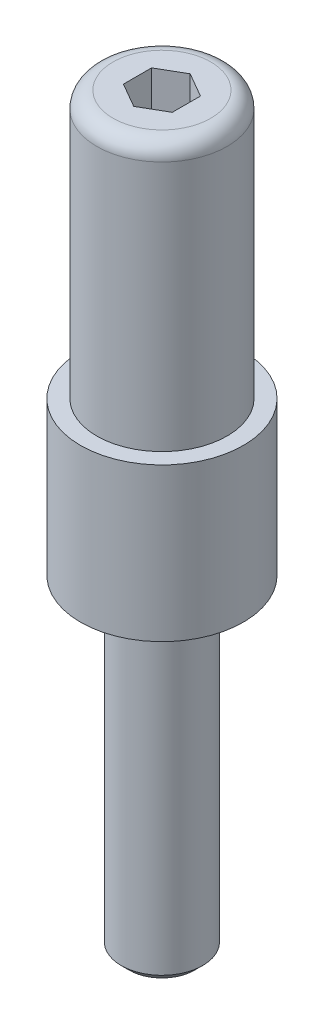
ISO-10303-21;
HEADER;
FILE_DESCRIPTION(('STEP AP214'),'2;1');
FILE_NAME('part.step','',(''),(''),'','','');
FILE_SCHEMA(('AUTOMOTIVE_DESIGN { 1 0 10303 214 1 1 1 1 }'));
ENDSEC;
DATA;
#1=APPLICATION_CONTEXT('core data for automotive mechanical design processes');
#2=APPLICATION_PROTOCOL_DEFINITION('international standard','automotive_design',2000,#1);
#3=PRODUCT_CONTEXT('',#1,'mechanical');
#4=PRODUCT('Part','Part','',(#3));
#5=PRODUCT_RELATED_PRODUCT_CATEGORY('part','',(#4));
#6=PRODUCT_DEFINITION_FORMATION('','',#4);
#7=PRODUCT_DEFINITION_CONTEXT('part definition',#1,'design');
#8=PRODUCT_DEFINITION('design','',#6,#7);
#9=PRODUCT_DEFINITION_SHAPE('','',#8);
#10=(LENGTH_UNIT() NAMED_UNIT(*) SI_UNIT(.MILLI.,.METRE.));
#11=(NAMED_UNIT(*) PLANE_ANGLE_UNIT() SI_UNIT($,.RADIAN.));
#12=(NAMED_UNIT(*) SI_UNIT($,.STERADIAN.) SOLID_ANGLE_UNIT());
#13=UNCERTAINTY_MEASURE_WITH_UNIT(LENGTH_MEASURE(1.E-05),#10,'distance_accuracy_value','');
#14=(GEOMETRIC_REPRESENTATION_CONTEXT(3) GLOBAL_UNCERTAINTY_ASSIGNED_CONTEXT((#13)) GLOBAL_UNIT_ASSIGNED_CONTEXT((#10,
#11,#12)) REPRESENTATION_CONTEXT('',''));
#15=CARTESIAN_POINT('',(0.,0.,0.));
#16=DIRECTION('',(0.,0.,1.));
#17=DIRECTION('',(1.,0.,0.));
#18=AXIS2_PLACEMENT_3D('',#15,#16,#17);
#19=CARTESIAN_POINT('',(0.,25.8,0.));
#20=DIRECTION('',(0.,-1.,0.));
#21=DIRECTION('',(0.,0.,-1.));
#22=AXIS2_PLACEMENT_3D('',#19,#20,#21);
#23=PLANE('',#22);
#24=DIRECTION('',(0.,0.,-1.));
#25=VECTOR('',#24,1.);
#26=CARTESIAN_POINT('',(-1.5,25.8,0.));
#27=LINE('',#26,#25);
#28=CARTESIAN_POINT('',(-1.5,25.8,0.866025403784439));
#29=VERTEX_POINT('',#28);
#30=CARTESIAN_POINT('',(-1.5,25.8,-0.866025403784439));
#31=VERTEX_POINT('',#30);
#32=EDGE_CURVE('E152',#29,#31,#27,.T.);
#33=ORIENTED_EDGE('',*,*,#32,.T.);
#34=DIRECTION('',(0.866025403784439,0.,-0.5));
#35=VECTOR('',#34,1.);
#36=CARTESIAN_POINT('',(-0.75,25.8,-1.29903810567666));
#37=LINE('',#36,#35);
#38=CARTESIAN_POINT('',(0.,25.8,-1.73205080756888));
#39=VERTEX_POINT('',#38);
#40=EDGE_CURVE('E11',#31,#39,#37,.T.);
#41=ORIENTED_EDGE('',*,*,#40,.T.);
#42=DIRECTION('',(0.866025403784439,0.,0.5));
#43=VECTOR('',#42,1.);
#44=CARTESIAN_POINT('',(0.75,25.8,-1.29903810567666));
#45=LINE('',#44,#43);
#46=CARTESIAN_POINT('',(1.5,25.8,-0.866025403784439));
#47=VERTEX_POINT('',#46);
#48=EDGE_CURVE('E44',#39,#47,#45,.T.);
#49=ORIENTED_EDGE('',*,*,#48,.T.);
#50=DIRECTION('',(0.,0.,1.));
#51=VECTOR('',#50,1.);
#52=CARTESIAN_POINT('',(1.5,25.8,0.));
#53=LINE('',#52,#51);
#54=CARTESIAN_POINT('',(1.5,25.8,0.866025403784439));
#55=VERTEX_POINT('',#54);
#56=EDGE_CURVE('E160',#47,#55,#53,.T.);
#57=ORIENTED_EDGE('',*,*,#56,.T.);
#58=DIRECTION('',(-0.866025403784439,0.,0.5));
#59=VECTOR('',#58,1.);
#60=CARTESIAN_POINT('',(0.75,25.8,1.29903810567666));
#61=LINE('',#60,#59);
#62=CARTESIAN_POINT('',(0.,25.8,1.73205080756888));
#63=VERTEX_POINT('',#62);
#64=EDGE_CURVE('E157',#55,#63,#61,.T.);
#65=ORIENTED_EDGE('',*,*,#64,.T.);
#66=DIRECTION('',(-0.866025403784439,0.,-0.5));
#67=VECTOR('',#66,1.);
#68=CARTESIAN_POINT('',(-0.75,25.8,1.29903810567666));
#69=LINE('',#68,#67);
#70=EDGE_CURVE('E154',#63,#29,#69,.T.);
#71=ORIENTED_EDGE('',*,*,#70,.T.);
#72=EDGE_LOOP('',(#33,#41,#49,#57,#65,#71));
#73=FACE_BOUND('',#72,.T.);
#74=CARTESIAN_POINT('',(0.,25.8,0.));
#75=DIRECTION('',(0.,1.,0.));
#76=DIRECTION('',(0.,0.,1.));
#77=AXIS2_PLACEMENT_3D('',#74,#75,#76);
#78=CIRCLE('',#77,3.);
#79=CARTESIAN_POINT('',(0.,25.8,3.));
#80=VERTEX_POINT('',#79);
#81=EDGE_CURVE('E149',#80,#80,#78,.T.);
#82=ORIENTED_EDGE('',*,*,#81,.T.);
#83=EDGE_LOOP('',(#82));
#84=FACE_BOUND('',#83,.T.);
#85=ADVANCED_FACE('F37',(#73,#84),#23,.F.);
#86=CARTESIAN_POINT('',(0.,24.8,0.));
#87=DIRECTION('',(0.,1.,0.));
#88=DIRECTION('',(0.,0.,1.));
#89=AXIS2_PLACEMENT_3D('',#86,#87,#88);
#90=TOROIDAL_SURFACE('',#89,3.,1.);
#91=ORIENTED_EDGE('',*,*,#81,.F.);
#92=EDGE_LOOP('',(#91));
#93=FACE_BOUND('',#92,.T.);
#94=CARTESIAN_POINT('',(0.,24.8,0.));
#95=DIRECTION('',(0.,1.,0.));
#96=DIRECTION('',(0.,0.,1.));
#97=AXIS2_PLACEMENT_3D('',#94,#95,#96);
#98=CIRCLE('',#97,4.);
#99=CARTESIAN_POINT('',(0.,24.8,4.));
#100=VERTEX_POINT('',#99);
#101=EDGE_CURVE('E146',#100,#100,#98,.T.);
#102=ORIENTED_EDGE('',*,*,#101,.T.);
#103=EDGE_LOOP('',(#102));
#104=FACE_BOUND('',#103,.T.);
#105=ADVANCED_FACE('F184',(#93,#104),#90,.T.);
#106=CARTESIAN_POINT('',(0.,-20.,0.));
#107=DIRECTION('',(0.,1.,0.));
#108=DIRECTION('',(0.,0.,1.));
#109=AXIS2_PLACEMENT_3D('',#106,#107,#108);
#110=CYLINDRICAL_SURFACE('',#109,4.);
#111=ORIENTED_EDGE('',*,*,#101,.F.);
#112=EDGE_LOOP('',(#111));
#113=FACE_BOUND('',#112,.T.);
#114=CARTESIAN_POINT('',(0.,9.4,0.));
#115=DIRECTION('',(0.,1.,0.));
#116=DIRECTION('',(0.,0.,1.));
#117=AXIS2_PLACEMENT_3D('',#114,#115,#116);
#118=CIRCLE('',#117,4.);
#119=CARTESIAN_POINT('',(0.,9.4,4.));
#120=VERTEX_POINT('',#119);
#121=EDGE_CURVE('E143',#120,#120,#118,.T.);
#122=ORIENTED_EDGE('',*,*,#121,.T.);
#123=EDGE_LOOP('',(#122));
#124=FACE_BOUND('',#123,.T.);
#125=ADVANCED_FACE('F188',(#113,#124),#110,.T.);
#126=CARTESIAN_POINT('',(4.,9.4,0.));
#127=DIRECTION('',(0.,-1.,0.));
#128=DIRECTION('',(0.,0.,-1.));
#129=AXIS2_PLACEMENT_3D('',#126,#127,#128);
#130=PLANE('',#129);
#131=ORIENTED_EDGE('',*,*,#121,.F.);
#132=EDGE_LOOP('',(#131));
#133=FACE_BOUND('',#132,.T.);
#134=CARTESIAN_POINT('',(0.,9.4,0.));
#135=DIRECTION('',(0.,1.,0.));
#136=DIRECTION('',(0.,0.,1.));
#137=AXIS2_PLACEMENT_3D('',#134,#135,#136);
#138=CIRCLE('',#137,5.);
#139=CARTESIAN_POINT('',(0.,9.4,5.));
#140=VERTEX_POINT('',#139);
#141=EDGE_CURVE('E140',#140,#140,#138,.T.);
#142=ORIENTED_EDGE('',*,*,#141,.T.);
#143=EDGE_LOOP('',(#142));
#144=FACE_BOUND('',#143,.T.);
#145=ADVANCED_FACE('F193',(#133,#144),#130,.F.);
#146=CARTESIAN_POINT('',(0.,-20.,0.));
#147=DIRECTION('',(0.,1.,0.));
#148=DIRECTION('',(0.,0.,1.));
#149=AXIS2_PLACEMENT_3D('',#146,#147,#148);
#150=CYLINDRICAL_SURFACE('',#149,5.);
#151=ORIENTED_EDGE('',*,*,#141,.F.);
#152=EDGE_LOOP('',(#151));
#153=FACE_BOUND('',#152,.T.);
#154=CARTESIAN_POINT('',(0.,0.,0.));
#155=DIRECTION('',(0.,1.,0.));
#156=DIRECTION('',(0.,0.,1.));
#157=AXIS2_PLACEMENT_3D('',#154,#155,#156);
#158=CIRCLE('',#157,5.);
#159=CARTESIAN_POINT('',(0.,0.,5.));
#160=VERTEX_POINT('',#159);
#161=EDGE_CURVE('E137',#160,#160,#158,.T.);
#162=ORIENTED_EDGE('',*,*,#161,.T.);
#163=EDGE_LOOP('',(#162));
#164=FACE_BOUND('',#163,.T.);
#165=ADVANCED_FACE('F201',(#153,#164),#150,.T.);
#166=CARTESIAN_POINT('',(5.,0.,0.));
#167=DIRECTION('',(0.,1.,0.));
#168=DIRECTION('',(0.,0.,1.));
#169=AXIS2_PLACEMENT_3D('',#166,#167,#168);
#170=PLANE('',#169);
#171=ORIENTED_EDGE('',*,*,#161,.F.);
#172=EDGE_LOOP('',(#171));
#173=FACE_BOUND('',#172,.T.);
#174=CARTESIAN_POINT('',(0.,0.,0.));
#175=DIRECTION('',(0.,1.,0.));
#176=DIRECTION('',(0.,0.,1.));
#177=AXIS2_PLACEMENT_3D('',#174,#175,#176);
#178=CIRCLE('',#177,2.5);
#179=CARTESIAN_POINT('',(0.,0.,2.5));
#180=VERTEX_POINT('',#179);
#181=EDGE_CURVE('E134',#180,#180,#178,.T.);
#182=ORIENTED_EDGE('',*,*,#181,.T.);
#183=EDGE_LOOP('',(#182));
#184=FACE_BOUND('',#183,.T.);
#185=ADVANCED_FACE('F205',(#173,#184),#170,.F.);
#186=CARTESIAN_POINT('',(0.,-20.,0.));
#187=DIRECTION('',(0.,1.,0.));
#188=DIRECTION('',(0.,0.,1.));
#189=AXIS2_PLACEMENT_3D('',#186,#187,#188);
#190=CYLINDRICAL_SURFACE('',#189,2.5);
#191=ORIENTED_EDGE('',*,*,#181,.F.);
#192=EDGE_LOOP('',(#191));
#193=FACE_BOUND('',#192,.T.);
#194=CARTESIAN_POINT('',(0.,-19.5095,0.));
#195=DIRECTION('',(0.,1.,0.));
#196=DIRECTION('',(0.,0.,1.));
#197=AXIS2_PLACEMENT_3D('',#194,#195,#196);
#198=CIRCLE('',#197,2.5);
#199=CARTESIAN_POINT('',(0.,-19.5095,2.5));
#200=VERTEX_POINT('',#199);
#201=EDGE_CURVE('E131',#200,#200,#198,.T.);
#202=ORIENTED_EDGE('',*,*,#201,.T.);
#203=EDGE_LOOP('',(#202));
#204=FACE_BOUND('',#203,.T.);
#205=ADVANCED_FACE('F209',(#193,#204),#190,.T.);
#206=CARTESIAN_POINT('',(0.,-20.,0.));
#207=DIRECTION('',(0.,1.,0.));
#208=DIRECTION('',(0.,0.,1.));
#209=AXIS2_PLACEMENT_3D('',#206,#207,#208);
#210=CONICAL_SURFACE('',#209,2.0095,0.785398163397447);
#211=ORIENTED_EDGE('',*,*,#201,.F.);
#212=EDGE_LOOP('',(#211));
#213=FACE_BOUND('',#212,.T.);
#214=CARTESIAN_POINT('',(0.,-20.,0.));
#215=DIRECTION('',(0.,1.,0.));
#216=DIRECTION('',(0.,0.,1.));
#217=AXIS2_PLACEMENT_3D('',#214,#215,#216);
#218=CIRCLE('',#217,2.0095);
#219=CARTESIAN_POINT('',(0.,-20.,2.0095));
#220=VERTEX_POINT('',#219);
#221=EDGE_CURVE('E119',#220,#220,#218,.T.);
#222=ORIENTED_EDGE('',*,*,#221,.T.);
#223=EDGE_LOOP('',(#222));
#224=FACE_BOUND('',#223,.T.);
#225=ADVANCED_FACE('F213',(#213,#224),#210,.T.);
#226=CARTESIAN_POINT('',(2.0095,-20.,0.));
#227=DIRECTION('',(0.,1.,0.));
#228=DIRECTION('',(0.,0.,1.));
#229=AXIS2_PLACEMENT_3D('',#226,#227,#228);
#230=PLANE('',#229);
#231=ORIENTED_EDGE('',*,*,#221,.F.);
#232=EDGE_LOOP('',(#231));
#233=FACE_BOUND('',#232,.T.);
#234=ADVANCED_FACE('F180',(#233),#230,.F.);
#235=CARTESIAN_POINT('',(0.,22.8,-1.73205080756888));
#236=DIRECTION('',(-0.5,0.,-0.866025403784439));
#237=DIRECTION('',(-0.866025403784439,0.,0.5));
#238=AXIS2_PLACEMENT_3D('',#235,#236,#237);
#239=PLANE('',#238);
#240=DIRECTION('',(0.,1.,0.));
#241=VECTOR('',#240,1.);
#242=CARTESIAN_POINT('',(-1.5,22.8,-0.866025403784439));
#243=LINE('',#242,#241);
#244=CARTESIAN_POINT('',(-1.5,22.8,-0.866025403784439));
#245=VERTEX_POINT('',#244);
#246=EDGE_CURVE('E51',#245,#31,#243,.T.);
#247=ORIENTED_EDGE('',*,*,#246,.F.);
#248=DIRECTION('',(-0.866025403784439,0.,0.5));
#249=VECTOR('',#248,1.);
#250=CARTESIAN_POINT('',(0.,22.8,-1.73205080756888));
#251=LINE('',#250,#249);
#252=CARTESIAN_POINT('',(0.,22.8,-1.73205080756888));
#253=VERTEX_POINT('',#252);
#254=EDGE_CURVE('E90',#253,#245,#251,.T.);
#255=ORIENTED_EDGE('',*,*,#254,.F.);
#256=DIRECTION('',(0.,1.,0.));
#257=VECTOR('',#256,1.);
#258=CARTESIAN_POINT('',(0.,22.8,-1.73205080756888));
#259=LINE('',#258,#257);
#260=EDGE_CURVE('E117',#253,#39,#259,.T.);
#261=ORIENTED_EDGE('',*,*,#260,.T.);
#262=ORIENTED_EDGE('',*,*,#40,.F.);
#263=EDGE_LOOP('',(#247,#255,#261,#262));
#264=FACE_BOUND('',#263,.T.);
#265=ADVANCED_FACE('F88',(#264),#239,.F.);
#266=CARTESIAN_POINT('',(1.5,22.8,-0.866025403784439));
#267=DIRECTION('',(0.5,0.,-0.866025403784439));
#268=DIRECTION('',(-0.866025403784439,0.,-0.5));
#269=AXIS2_PLACEMENT_3D('',#266,#267,#268);
#270=PLANE('',#269);
#271=ORIENTED_EDGE('',*,*,#260,.F.);
#272=DIRECTION('',(-0.866025403784439,0.,-0.5));
#273=VECTOR('',#272,1.);
#274=CARTESIAN_POINT('',(1.5,22.8,-0.866025403784439));
#275=LINE('',#274,#273);
#276=CARTESIAN_POINT('',(1.5,22.8,-0.866025403784439));
#277=VERTEX_POINT('',#276);
#278=EDGE_CURVE('E94',#277,#253,#275,.T.);
#279=ORIENTED_EDGE('',*,*,#278,.F.);
#280=DIRECTION('',(0.,1.,0.));
#281=VECTOR('',#280,1.);
#282=CARTESIAN_POINT('',(1.5,22.8,-0.866025403784439));
#283=LINE('',#282,#281);
#284=EDGE_CURVE('E120',#277,#47,#283,.T.);
#285=ORIENTED_EDGE('',*,*,#284,.T.);
#286=ORIENTED_EDGE('',*,*,#48,.F.);
#287=EDGE_LOOP('',(#271,#279,#285,#286));
#288=FACE_BOUND('',#287,.T.);
#289=ADVANCED_FACE('F172',(#288),#270,.F.);
#290=CARTESIAN_POINT('',(1.5,22.8,0.866025403784439));
#291=DIRECTION('',(1.,0.,0.));
#292=DIRECTION('',(0.,0.,-1.));
#293=AXIS2_PLACEMENT_3D('',#290,#291,#292);
#294=PLANE('',#293);
#295=ORIENTED_EDGE('',*,*,#284,.F.);
#296=DIRECTION('',(0.,0.,-1.));
#297=VECTOR('',#296,1.);
#298=CARTESIAN_POINT('',(1.5,22.8,0.866025403784439));
#299=LINE('',#298,#297);
#300=CARTESIAN_POINT('',(1.5,22.8,0.866025403784439));
#301=VERTEX_POINT('',#300);
#302=EDGE_CURVE('E114',#301,#277,#299,.T.);
#303=ORIENTED_EDGE('',*,*,#302,.F.);
#304=DIRECTION('',(0.,1.,0.));
#305=VECTOR('',#304,1.);
#306=CARTESIAN_POINT('',(1.5,22.8,0.866025403784439));
#307=LINE('',#306,#305);
#308=EDGE_CURVE('E122',#301,#55,#307,.T.);
#309=ORIENTED_EDGE('',*,*,#308,.T.);
#310=ORIENTED_EDGE('',*,*,#56,.F.);
#311=EDGE_LOOP('',(#295,#303,#309,#310));
#312=FACE_BOUND('',#311,.T.);
#313=ADVANCED_FACE('F171',(#312),#294,.F.);
#314=CARTESIAN_POINT('',(0.,22.8,1.73205080756888));
#315=DIRECTION('',(0.5,0.,0.866025403784439));
#316=DIRECTION('',(0.866025403784439,0.,-0.5));
#317=AXIS2_PLACEMENT_3D('',#314,#315,#316);
#318=PLANE('',#317);
#319=ORIENTED_EDGE('',*,*,#308,.F.);
#320=DIRECTION('',(0.866025403784439,0.,-0.5));
#321=VECTOR('',#320,1.);
#322=CARTESIAN_POINT('',(0.,22.8,1.73205080756888));
#323=LINE('',#322,#321);
#324=CARTESIAN_POINT('',(0.,22.8,1.73205080756888));
#325=VERTEX_POINT('',#324);
#326=EDGE_CURVE('E111',#325,#301,#323,.T.);
#327=ORIENTED_EDGE('',*,*,#326,.F.);
#328=DIRECTION('',(0.,1.,0.));
#329=VECTOR('',#328,1.);
#330=CARTESIAN_POINT('',(0.,22.8,1.73205080756888));
#331=LINE('',#330,#329);
#332=EDGE_CURVE('E125',#325,#63,#331,.T.);
#333=ORIENTED_EDGE('',*,*,#332,.T.);
#334=ORIENTED_EDGE('',*,*,#64,.F.);
#335=EDGE_LOOP('',(#319,#327,#333,#334));
#336=FACE_BOUND('',#335,.T.);
#337=ADVANCED_FACE('F169',(#336),#318,.F.);
#338=CARTESIAN_POINT('',(-1.5,22.8,0.866025403784439));
#339=DIRECTION('',(-0.5,0.,0.866025403784439));
#340=DIRECTION('',(0.866025403784439,0.,0.5));
#341=AXIS2_PLACEMENT_3D('',#338,#339,#340);
#342=PLANE('',#341);
#343=ORIENTED_EDGE('',*,*,#332,.F.);
#344=DIRECTION('',(0.866025403784439,0.,0.5));
#345=VECTOR('',#344,1.);
#346=CARTESIAN_POINT('',(-1.5,22.8,0.866025403784439));
#347=LINE('',#346,#345);
#348=CARTESIAN_POINT('',(-1.5,22.8,0.866025403784439));
#349=VERTEX_POINT('',#348);
#350=EDGE_CURVE('E103',#349,#325,#347,.T.);
#351=ORIENTED_EDGE('',*,*,#350,.F.);
#352=DIRECTION('',(0.,1.,0.));
#353=VECTOR('',#352,1.);
#354=CARTESIAN_POINT('',(-1.5,22.8,0.866025403784439));
#355=LINE('',#354,#353);
#356=EDGE_CURVE('E93',#349,#29,#355,.T.);
#357=ORIENTED_EDGE('',*,*,#356,.T.);
#358=ORIENTED_EDGE('',*,*,#70,.F.);
#359=EDGE_LOOP('',(#343,#351,#357,#358));
#360=FACE_BOUND('',#359,.T.);
#361=ADVANCED_FACE('F165',(#360),#342,.F.);
#362=CARTESIAN_POINT('',(-1.5,22.8,-0.866025403784439));
#363=DIRECTION('',(-1.,0.,0.));
#364=DIRECTION('',(0.,0.,1.));
#365=AXIS2_PLACEMENT_3D('',#362,#363,#364);
#366=PLANE('',#365);
#367=ORIENTED_EDGE('',*,*,#356,.F.);
#368=DIRECTION('',(0.,0.,1.));
#369=VECTOR('',#368,1.);
#370=CARTESIAN_POINT('',(-1.5,22.8,-0.866025403784439));
#371=LINE('',#370,#369);
#372=EDGE_CURVE('E97',#245,#349,#371,.T.);
#373=ORIENTED_EDGE('',*,*,#372,.F.);
#374=ORIENTED_EDGE('',*,*,#246,.T.);
#375=ORIENTED_EDGE('',*,*,#32,.F.);
#376=EDGE_LOOP('',(#367,#373,#374,#375));
#377=FACE_BOUND('',#376,.T.);
#378=ADVANCED_FACE('F98',(#377),#366,.F.);
#379=CARTESIAN_POINT('',(0.,22.8,0.));
#380=DIRECTION('',(0.,1.,0.));
#381=DIRECTION('',(0.,0.,1.));
#382=AXIS2_PLACEMENT_3D('',#379,#380,#381);
#383=PLANE('',#382);
#384=ORIENTED_EDGE('',*,*,#254,.T.);
#385=ORIENTED_EDGE('',*,*,#372,.T.);
#386=ORIENTED_EDGE('',*,*,#350,.T.);
#387=ORIENTED_EDGE('',*,*,#326,.T.);
#388=ORIENTED_EDGE('',*,*,#302,.T.);
#389=ORIENTED_EDGE('',*,*,#278,.T.);
#390=EDGE_LOOP('',(#384,#385,#386,#387,#388,#389));
#391=FACE_BOUND('',#390,.T.);
#392=ADVANCED_FACE('F105',(#391),#383,.T.);
#393=CLOSED_SHELL('',(#85,#105,#125,#145,#165,#185,#205,#225,#234,#265,#289,#313,#337,#361,#378,#392));
#394=MANIFOLD_SOLID_BREP('B2',#393);
#395=ADVANCED_BREP_SHAPE_REPRESENTATION('',(#18,#394),#14);
#396=SHAPE_DEFINITION_REPRESENTATION(#9,#395);
ENDSEC;
END-ISO-10303-21;
